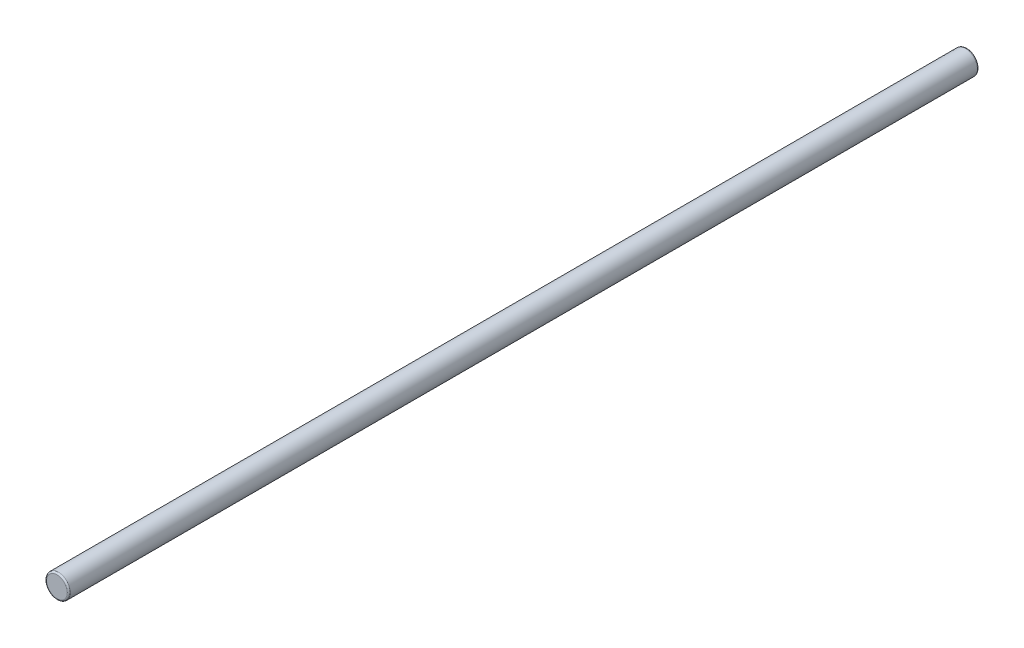
ISO-10303-21;
HEADER;
FILE_DESCRIPTION(('STEP AP214'),'2;1');
FILE_NAME('part.step','',(''),(''),'','','');
FILE_SCHEMA(('AUTOMOTIVE_DESIGN { 1 0 10303 214 1 1 1 1 }'));
ENDSEC;
DATA;
#1=APPLICATION_CONTEXT('core data for automotive mechanical design processes');
#2=APPLICATION_PROTOCOL_DEFINITION('international standard','automotive_design',2000,#1);
#3=PRODUCT_CONTEXT('',#1,'mechanical');
#4=PRODUCT('Part','Part','',(#3));
#5=PRODUCT_RELATED_PRODUCT_CATEGORY('part','',(#4));
#6=PRODUCT_DEFINITION_FORMATION('','',#4);
#7=PRODUCT_DEFINITION_CONTEXT('part definition',#1,'design');
#8=PRODUCT_DEFINITION('design','',#6,#7);
#9=PRODUCT_DEFINITION_SHAPE('','',#8);
#10=(LENGTH_UNIT() NAMED_UNIT(*) SI_UNIT(.MILLI.,.METRE.));
#11=(NAMED_UNIT(*) PLANE_ANGLE_UNIT() SI_UNIT($,.RADIAN.));
#12=(NAMED_UNIT(*) SI_UNIT($,.STERADIAN.) SOLID_ANGLE_UNIT());
#13=UNCERTAINTY_MEASURE_WITH_UNIT(LENGTH_MEASURE(1.E-05),#10,'distance_accuracy_value','');
#14=(GEOMETRIC_REPRESENTATION_CONTEXT(3) GLOBAL_UNCERTAINTY_ASSIGNED_CONTEXT((#13)) GLOBAL_UNIT_ASSIGNED_CONTEXT((#10,
#11,#12)) REPRESENTATION_CONTEXT('',''));
#15=CARTESIAN_POINT('',(0.,0.,0.));
#16=DIRECTION('',(0.,0.,1.));
#17=DIRECTION('',(1.,0.,0.));
#18=AXIS2_PLACEMENT_3D('',#15,#16,#17);
#19=CARTESIAN_POINT('',(0.,0.,-304.8));
#20=DIRECTION('',(0.,0.,1.));
#21=DIRECTION('',(1.,0.,0.));
#22=AXIS2_PLACEMENT_3D('',#19,#20,#21);
#23=CYLINDRICAL_SURFACE('',#22,3.96875);
#24=CARTESIAN_POINT('',(0.,0.,-0.508000000000008));
#25=DIRECTION('',(0.,0.,1.));
#26=DIRECTION('',(1.,0.,0.));
#27=AXIS2_PLACEMENT_3D('',#24,#25,#26);
#28=CIRCLE('',#27,3.96875);
#29=CARTESIAN_POINT('',(3.96875,0.,-0.508000000000064));
#30=VERTEX_POINT('',#29);
#31=EDGE_CURVE('E36',#30,#30,#28,.F.);
#32=CARTESIAN_POINT('',(0.,0.,-304.292));
#33=DIRECTION('',(0.,0.,1.));
#34=DIRECTION('',(1.,0.,0.));
#35=AXIS2_PLACEMENT_3D('',#32,#33,#34);
#36=CIRCLE('',#35,3.96875);
#37=CARTESIAN_POINT('',(3.96875,0.,-304.292));
#38=VERTEX_POINT('',#37);
#39=EDGE_CURVE('E40',#38,#38,#36,.T.);
#40=CARTESIAN_POINT('',(3.96875,0.,-0.508000000000064));
#41=CARTESIAN_POINT('',(3.96875,0.,-3.67241666666673));
#42=CARTESIAN_POINT('',(3.96875,0.,-6.8368333333334));
#43=CARTESIAN_POINT('',(3.96875,0.,-13.1656666666667));
#44=CARTESIAN_POINT('',(3.96875,0.,-16.3300833333334));
#45=CARTESIAN_POINT('',(3.96875,0.,-22.6589166666668));
#46=CARTESIAN_POINT('',(3.96875,0.,-25.8233333333334));
#47=CARTESIAN_POINT('',(3.96875,0.,-32.1521666666668));
#48=CARTESIAN_POINT('',(3.96875,0.,-35.3165833333334));
#49=CARTESIAN_POINT('',(3.96875,0.,-41.6454166666667));
#50=CARTESIAN_POINT('',(3.96875,0.,-44.8098333333334));
#51=CARTESIAN_POINT('',(3.96875,0.,-51.1386666666667));
#52=CARTESIAN_POINT('',(3.96875,0.,-54.3030833333334));
#53=CARTESIAN_POINT('',(3.96875,0.,-60.6319166666667));
#54=CARTESIAN_POINT('',(3.96875,0.,-63.7963333333334));
#55=CARTESIAN_POINT('',(3.96875,0.,-70.1251666666667));
#56=CARTESIAN_POINT('',(3.96875,0.,-73.2895833333334));
#57=CARTESIAN_POINT('',(3.96875,0.,-79.6184166666667));
#58=CARTESIAN_POINT('',(3.96875,0.,-82.7828333333334));
#59=CARTESIAN_POINT('',(3.96875,0.,-89.1116666666667));
#60=CARTESIAN_POINT('',(3.96875,0.,-92.2760833333334));
#61=CARTESIAN_POINT('',(3.96875,0.,-98.6049166666667));
#62=CARTESIAN_POINT('',(3.96875,0.,-101.769333333333));
#63=CARTESIAN_POINT('',(3.96875,0.,-108.098166666667));
#64=CARTESIAN_POINT('',(3.96875,0.,-111.262583333333));
#65=CARTESIAN_POINT('',(3.96875,0.,-117.591416666667));
#66=CARTESIAN_POINT('',(3.96875,0.,-120.755833333333));
#67=CARTESIAN_POINT('',(3.96875,0.,-127.084666666667));
#68=CARTESIAN_POINT('',(3.96875,0.,-130.249083333333));
#69=CARTESIAN_POINT('',(3.96875,0.,-136.577916666667));
#70=CARTESIAN_POINT('',(3.96875,0.,-139.742333333333));
#71=CARTESIAN_POINT('',(3.96875,0.,-146.071166666667));
#72=CARTESIAN_POINT('',(3.96875,0.,-149.235583333333));
#73=CARTESIAN_POINT('',(3.96875,0.,-155.564416666667));
#74=CARTESIAN_POINT('',(3.96875,0.,-158.728833333333));
#75=CARTESIAN_POINT('',(3.96875,0.,-165.057666666667));
#76=CARTESIAN_POINT('',(3.96875,0.,-168.222083333333));
#77=CARTESIAN_POINT('',(3.96875,0.,-174.550916666667));
#78=CARTESIAN_POINT('',(3.96875,0.,-177.715333333333));
#79=CARTESIAN_POINT('',(3.96875,0.,-184.044166666667));
#80=CARTESIAN_POINT('',(3.96875,0.,-187.208583333333));
#81=CARTESIAN_POINT('',(3.96875,0.,-193.537416666667));
#82=CARTESIAN_POINT('',(3.96875,0.,-196.701833333333));
#83=CARTESIAN_POINT('',(3.96875,0.,-203.030666666667));
#84=CARTESIAN_POINT('',(3.96875,0.,-206.195083333333));
#85=CARTESIAN_POINT('',(3.96875,0.,-212.523916666667));
#86=CARTESIAN_POINT('',(3.96875,0.,-215.688333333333));
#87=CARTESIAN_POINT('',(3.96875,0.,-222.017166666667));
#88=CARTESIAN_POINT('',(3.96875,0.,-225.181583333333));
#89=CARTESIAN_POINT('',(3.96875,0.,-231.510416666667));
#90=CARTESIAN_POINT('',(3.96875,0.,-234.674833333333));
#91=CARTESIAN_POINT('',(3.96875,0.,-241.003666666667));
#92=CARTESIAN_POINT('',(3.96875,0.,-244.168083333333));
#93=CARTESIAN_POINT('',(3.96875,0.,-250.496916666667));
#94=CARTESIAN_POINT('',(3.96875,0.,-253.661333333333));
#95=CARTESIAN_POINT('',(3.96875,0.,-259.990166666667));
#96=CARTESIAN_POINT('',(3.96875,0.,-263.154583333333));
#97=CARTESIAN_POINT('',(3.96875,0.,-269.483416666667));
#98=CARTESIAN_POINT('',(3.96875,0.,-272.647833333333));
#99=CARTESIAN_POINT('',(3.96875,0.,-278.976666666667));
#100=CARTESIAN_POINT('',(3.96875,0.,-282.141083333333));
#101=CARTESIAN_POINT('',(3.96875,0.,-288.469916666667));
#102=CARTESIAN_POINT('',(3.96875,0.,-291.634333333333));
#103=CARTESIAN_POINT('',(3.96875,0.,-297.963166666667));
#104=CARTESIAN_POINT('',(3.96875,0.,-301.127583333333));
#105=CARTESIAN_POINT('',(3.96875,0.,-304.292));
#106=B_SPLINE_CURVE_WITH_KNOTS('',3,(#40,#41,#42,#43,#44,#45,#46,#47,#48,#49,#50,#51,#52,#53,
#54,#55,#56,#57,#58,#59,#60,#61,#62,#63,#64,#65,#66,#67,#68,#69,#70,#71,#72,#73,#74,#75,#76,#77,
#78,#79,#80,#81,#82,#83,#84,#85,#86,#87,#88,#89,#90,#91,#92,#93,#94,#95,#96,#97,#98,#99,#100,
#101,#102,#103,#104,#105),.UNSPECIFIED.,.F.,.F.,(4,2,2,2,2,2,2,2,2,2,2,2,2,2,2,2,2,2,2,2,2,2,2,
2,2,2,2,2,2,2,2,2,4),(0.,9.49325000000001,18.9865,28.47975,37.973,47.46625,56.9595,66.45275,
75.946,85.43925,94.9325,104.42575,113.919,123.41225,132.9055,142.39875,151.892,161.38525,
170.8785,180.37175,189.865,199.35825,208.8515,218.34475,227.838,237.33125,246.8245,256.31775,
265.811,275.30425,284.7975,294.29075,303.784),.UNSPECIFIED.);
#107=EDGE_CURVE('BSEAM30',#30,#38,#106,.T.);
#108=ORIENTED_EDGE('',*,*,#31,.T.);
#109=ORIENTED_EDGE('',*,*,#39,.T.);
#110=ORIENTED_EDGE('',*,*,#107,.T.);
#111=ORIENTED_EDGE('',*,*,#107,.F.);
#112=EDGE_LOOP('',(#108,#110,#109,#111));
#113=FACE_BOUND('',#112,.T.);
#114=ADVANCED_FACE('F30',(#113),#23,.T.);
#115=CARTESIAN_POINT('',(0.,0.,-304.8));
#116=DIRECTION('',(0.,0.,1.));
#117=DIRECTION('',(1.,0.,0.));
#118=AXIS2_PLACEMENT_3D('',#115,#116,#117);
#119=PLANE('',#118);
#120=CARTESIAN_POINT('',(0.,0.,-304.8));
#121=DIRECTION('',(0.,0.,1.));
#122=DIRECTION('',(1.,0.,0.));
#123=AXIS2_PLACEMENT_3D('',#120,#121,#122);
#124=CIRCLE('',#123,3.46075);
#125=CARTESIAN_POINT('',(3.46075,0.,-304.8));
#126=VERTEX_POINT('',#125);
#127=EDGE_CURVE('E10',#126,#126,#124,.F.);
#128=ORIENTED_EDGE('',*,*,#127,.T.);
#129=EDGE_LOOP('',(#128));
#130=FACE_BOUND('',#129,.T.);
#131=ADVANCED_FACE('F63',(#130),#119,.F.);
#132=CARTESIAN_POINT('',(0.,0.,0.));
#133=DIRECTION('',(0.,0.,1.));
#134=DIRECTION('',(1.,0.,0.));
#135=AXIS2_PLACEMENT_3D('',#132,#133,#134);
#136=PLANE('',#135);
#137=CARTESIAN_POINT('',(0.,0.,0.));
#138=DIRECTION('',(0.,0.,1.));
#139=DIRECTION('',(1.,0.,0.));
#140=AXIS2_PLACEMENT_3D('',#137,#138,#139);
#141=CIRCLE('',#140,3.46075);
#142=CARTESIAN_POINT('',(3.46075,0.,0.));
#143=VERTEX_POINT('',#142);
#144=EDGE_CURVE('E44',#143,#143,#141,.T.);
#145=ORIENTED_EDGE('',*,*,#144,.T.);
#146=EDGE_LOOP('',(#145));
#147=FACE_BOUND('',#146,.T.);
#148=ADVANCED_FACE('F50',(#147),#136,.T.);
#149=CARTESIAN_POINT('',(0.,0.,-0.508000000000008));
#150=DIRECTION('',(0.,0.,1.));
#151=DIRECTION('',(1.,0.,0.));
#152=AXIS2_PLACEMENT_3D('',#149,#150,#151);
#153=TOROIDAL_SURFACE('',#152,3.46075,0.508);
#154=ORIENTED_EDGE('',*,*,#31,.F.);
#155=EDGE_LOOP('',(#154));
#156=FACE_BOUND('',#155,.T.);
#157=ORIENTED_EDGE('',*,*,#144,.F.);
#158=EDGE_LOOP('',(#157));
#159=FACE_BOUND('',#158,.T.);
#160=ADVANCED_FACE('F52',(#156,#159),#153,.T.);
#161=CARTESIAN_POINT('',(0.,0.,-304.292));
#162=DIRECTION('',(0.,0.,1.));
#163=DIRECTION('',(1.,0.,0.));
#164=AXIS2_PLACEMENT_3D('',#161,#162,#163);
#165=TOROIDAL_SURFACE('',#164,3.46075,0.508);
#166=ORIENTED_EDGE('',*,*,#127,.F.);
#167=EDGE_LOOP('',(#166));
#168=FACE_BOUND('',#167,.T.);
#169=ORIENTED_EDGE('',*,*,#39,.F.);
#170=EDGE_LOOP('',(#169));
#171=FACE_BOUND('',#170,.T.);
#172=ADVANCED_FACE('F54',(#168,#171),#165,.T.);
#173=CLOSED_SHELL('',(#114,#131,#148,#160,#172));
#174=MANIFOLD_SOLID_BREP('B2',#173);
#175=ADVANCED_BREP_SHAPE_REPRESENTATION('',(#18,#174),#14);
#176=SHAPE_DEFINITION_REPRESENTATION(#9,#175);
ENDSEC;
END-ISO-10303-21;
